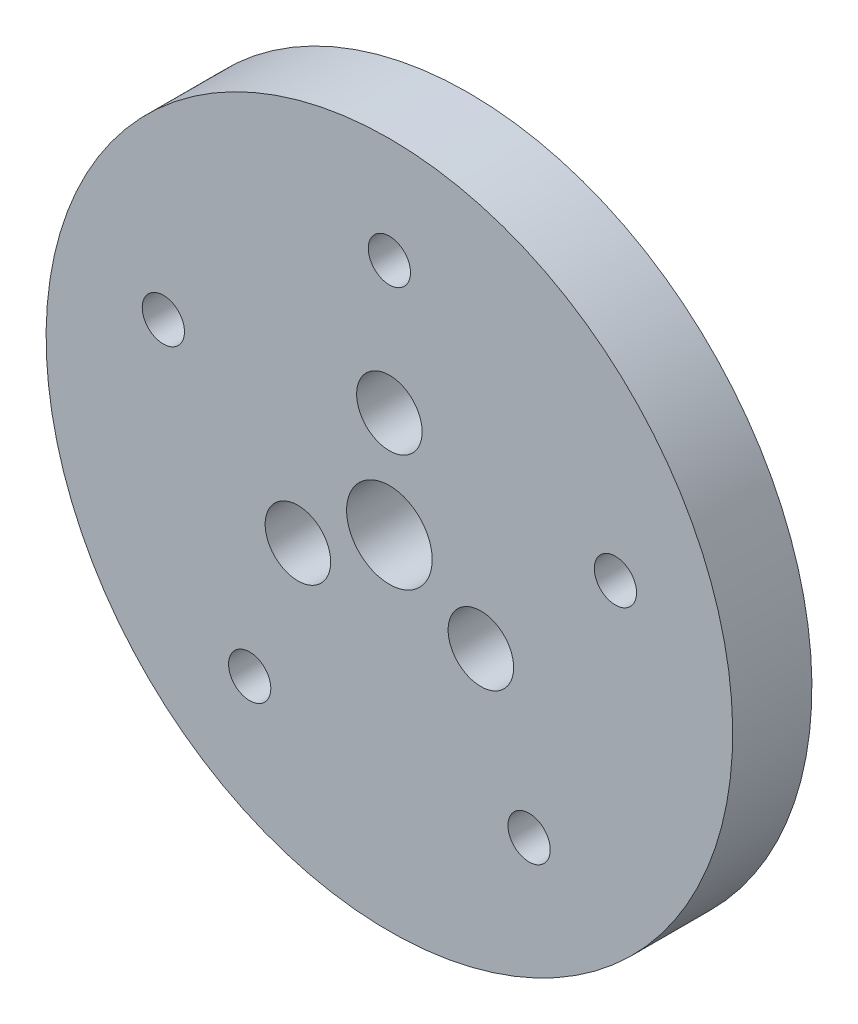
ISO-10303-21;
HEADER;
FILE_DESCRIPTION(('STEP AP214'),'2;1');
FILE_NAME('part.step','',(''),(''),'','','');
FILE_SCHEMA(('AUTOMOTIVE_DESIGN { 1 0 10303 214 1 1 1 1 }'));
ENDSEC;
DATA;
#1=APPLICATION_CONTEXT('core data for automotive mechanical design processes');
#2=APPLICATION_PROTOCOL_DEFINITION('international standard','automotive_design',2000,#1);
#3=PRODUCT_CONTEXT('',#1,'mechanical');
#4=PRODUCT('Part','Part','',(#3));
#5=PRODUCT_RELATED_PRODUCT_CATEGORY('part','',(#4));
#6=PRODUCT_DEFINITION_FORMATION('','',#4);
#7=PRODUCT_DEFINITION_CONTEXT('part definition',#1,'design');
#8=PRODUCT_DEFINITION('design','',#6,#7);
#9=PRODUCT_DEFINITION_SHAPE('','',#8);
#10=(LENGTH_UNIT() NAMED_UNIT(*) SI_UNIT(.MILLI.,.METRE.));
#11=(NAMED_UNIT(*) PLANE_ANGLE_UNIT() SI_UNIT($,.RADIAN.));
#12=(NAMED_UNIT(*) SI_UNIT($,.STERADIAN.) SOLID_ANGLE_UNIT());
#13=UNCERTAINTY_MEASURE_WITH_UNIT(LENGTH_MEASURE(1.E-05),#10,'distance_accuracy_value','');
#14=(GEOMETRIC_REPRESENTATION_CONTEXT(3) GLOBAL_UNCERTAINTY_ASSIGNED_CONTEXT((#13)) GLOBAL_UNIT_ASSIGNED_CONTEXT((#10,
#11,#12)) REPRESENTATION_CONTEXT('',''));
#15=CARTESIAN_POINT('',(0.,0.,0.));
#16=DIRECTION('',(0.,0.,1.));
#17=DIRECTION('',(1.,0.,0.));
#18=AXIS2_PLACEMENT_3D('',#15,#16,#17);
#19=CARTESIAN_POINT('',(0.,32.5,0.));
#20=DIRECTION('',(0.,0.,1.));
#21=DIRECTION('',(0.,-1.,0.));
#22=AXIS2_PLACEMENT_3D('',#19,#20,#21);
#23=PLANE('',#22);
#24=CARTESIAN_POINT('',(0.,10.,0.));
#25=DIRECTION('',(0.,0.,1.));
#26=DIRECTION('',(1.,0.,0.));
#27=AXIS2_PLACEMENT_3D('',#24,#25,#26);
#28=CIRCLE('',#27,3.1);
#29=CARTESIAN_POINT('',(3.1,10.,0.));
#30=VERTEX_POINT('',#29);
#31=EDGE_CURVE('E146',#30,#30,#28,.T.);
#32=ORIENTED_EDGE('',*,*,#31,.F.);
#33=EDGE_LOOP('',(#32));
#34=FACE_BOUND('',#33,.T.);
#35=CARTESIAN_POINT('',(8.66025403784437,-5.00000000000004,0.));
#36=DIRECTION('',(0.,0.,1.));
#37=DIRECTION('',(1.,0.,0.));
#38=AXIS2_PLACEMENT_3D('',#35,#36,#37);
#39=CIRCLE('',#38,3.1);
#40=CARTESIAN_POINT('',(11.7602540378444,-5.00000000000004,0.));
#41=VERTEX_POINT('',#40);
#42=EDGE_CURVE('E153',#41,#41,#39,.T.);
#43=ORIENTED_EDGE('',*,*,#42,.F.);
#44=EDGE_LOOP('',(#43));
#45=FACE_BOUND('',#44,.T.);
#46=CARTESIAN_POINT('',(-8.66025403784444,-4.99999999999992,0.));
#47=DIRECTION('',(0.,0.,1.));
#48=DIRECTION('',(1.,0.,0.));
#49=AXIS2_PLACEMENT_3D('',#46,#47,#48);
#50=CIRCLE('',#49,3.1);
#51=CARTESIAN_POINT('',(-5.56025403784444,-4.99999999999992,0.));
#52=VERTEX_POINT('',#51);
#53=EDGE_CURVE('E151',#52,#52,#50,.T.);
#54=ORIENTED_EDGE('',*,*,#53,.F.);
#55=EDGE_LOOP('',(#54));
#56=FACE_BOUND('',#55,.T.);
#57=CARTESIAN_POINT('',(-21.3987716166409,6.95288237343656,0.));
#58=DIRECTION('',(0.,0.,1.));
#59=DIRECTION('',(0.,-1.,0.));
#60=AXIS2_PLACEMENT_3D('',#57,#58,#59);
#61=CIRCLE('',#60,2.);
#62=CARTESIAN_POINT('',(-21.3987716166409,4.95288237343656,0.));
#63=VERTEX_POINT('',#62);
#64=EDGE_CURVE('E73',#63,#63,#61,.T.);
#65=ORIENTED_EDGE('',*,*,#64,.F.);
#66=EDGE_LOOP('',(#65));
#67=FACE_BOUND('',#66,.T.);
#68=CARTESIAN_POINT('',(-13.2251681765808,-18.2028823734362,0.));
#69=DIRECTION('',(0.,0.,1.));
#70=DIRECTION('',(0.,-1.,0.));
#71=AXIS2_PLACEMENT_3D('',#68,#69,#70);
#72=CIRCLE('',#71,2.);
#73=CARTESIAN_POINT('',(-13.2251681765808,-20.2028823734362,0.));
#74=VERTEX_POINT('',#73);
#75=EDGE_CURVE('E62',#74,#74,#72,.T.);
#76=ORIENTED_EDGE('',*,*,#75,.F.);
#77=EDGE_LOOP('',(#76));
#78=FACE_BOUND('',#77,.T.);
#79=CARTESIAN_POINT('',(13.2251681765805,-18.2028823734364,0.));
#80=DIRECTION('',(0.,0.,1.));
#81=DIRECTION('',(0.,-1.,0.));
#82=AXIS2_PLACEMENT_3D('',#79,#80,#81);
#83=CIRCLE('',#82,2.);
#84=CARTESIAN_POINT('',(13.2251681765805,-20.2028823734364,0.));
#85=VERTEX_POINT('',#84);
#86=EDGE_CURVE('E61',#85,#85,#83,.T.);
#87=ORIENTED_EDGE('',*,*,#86,.F.);
#88=EDGE_LOOP('',(#87));
#89=FACE_BOUND('',#88,.T.);
#90=CARTESIAN_POINT('',(21.398771616641,6.95288237343626,0.));
#91=DIRECTION('',(0.,0.,1.));
#92=DIRECTION('',(0.,-1.,0.));
#93=AXIS2_PLACEMENT_3D('',#90,#91,#92);
#94=CIRCLE('',#93,2.);
#95=CARTESIAN_POINT('',(21.398771616641,4.95288237343626,0.));
#96=VERTEX_POINT('',#95);
#97=EDGE_CURVE('E56',#96,#96,#94,.T.);
#98=ORIENTED_EDGE('',*,*,#97,.F.);
#99=EDGE_LOOP('',(#98));
#100=FACE_BOUND('',#99,.T.);
#101=CARTESIAN_POINT('',(0.,0.,0.));
#102=DIRECTION('',(0.,0.,1.));
#103=DIRECTION('',(1.,0.,0.));
#104=AXIS2_PLACEMENT_3D('',#101,#102,#103);
#105=CIRCLE('',#104,4.05);
#106=CARTESIAN_POINT('',(4.05,0.,0.));
#107=VERTEX_POINT('',#106);
#108=EDGE_CURVE('E90',#107,#107,#105,.T.);
#109=ORIENTED_EDGE('',*,*,#108,.F.);
#110=EDGE_LOOP('',(#109));
#111=FACE_BOUND('',#110,.T.);
#112=CARTESIAN_POINT('',(0.,22.5,0.));
#113=DIRECTION('',(0.,0.,1.));
#114=DIRECTION('',(1.,0.,0.));
#115=AXIS2_PLACEMENT_3D('',#112,#113,#114);
#116=CIRCLE('',#115,2.);
#117=CARTESIAN_POINT('',(2.,22.5,0.));
#118=VERTEX_POINT('',#117);
#119=EDGE_CURVE('E102',#118,#118,#116,.T.);
#120=ORIENTED_EDGE('',*,*,#119,.F.);
#121=EDGE_LOOP('',(#120));
#122=FACE_BOUND('',#121,.T.);
#123=CARTESIAN_POINT('',(0.,0.,0.));
#124=DIRECTION('',(0.,0.,-1.));
#125=DIRECTION('',(0.,1.,0.));
#126=AXIS2_PLACEMENT_3D('',#123,#124,#125);
#127=CIRCLE('',#126,32.5);
#128=CARTESIAN_POINT('',(0.,32.5,0.));
#129=VERTEX_POINT('',#128);
#130=EDGE_CURVE('E111',#129,#129,#127,.T.);
#131=ORIENTED_EDGE('',*,*,#130,.F.);
#132=EDGE_LOOP('',(#131));
#133=FACE_BOUND('',#132,.T.);
#134=ADVANCED_FACE('F39',(#34,#45,#56,#67,#78,#89,#100,#111,#122,#133),#23,.T.);
#135=CARTESIAN_POINT('',(0.,0.,-19.5));
#136=DIRECTION('',(0.,0.,-1.));
#137=DIRECTION('',(0.,1.,0.));
#138=AXIS2_PLACEMENT_3D('',#135,#136,#137);
#139=PLANE('',#138);
#140=CARTESIAN_POINT('',(0.,10.,-19.5));
#141=DIRECTION('',(0.,0.,-1.));
#142=DIRECTION('',(-1.,0.,0.));
#143=AXIS2_PLACEMENT_3D('',#140,#141,#142);
#144=CIRCLE('',#143,1.55);
#145=CARTESIAN_POINT('',(-1.55,10.,-19.5));
#146=VERTEX_POINT('',#145);
#147=EDGE_CURVE('E88',#146,#146,#144,.T.);
#148=ORIENTED_EDGE('',*,*,#147,.F.);
#149=EDGE_LOOP('',(#148));
#150=FACE_BOUND('',#149,.T.);
#151=CARTESIAN_POINT('',(-8.66025403784437,-5.00000000000004,-19.5));
#152=DIRECTION('',(0.,0.,-1.));
#153=DIRECTION('',(-1.,0.,0.));
#154=AXIS2_PLACEMENT_3D('',#151,#152,#153);
#155=CIRCLE('',#154,1.55);
#156=CARTESIAN_POINT('',(-10.2102540378444,-5.00000000000004,-19.5));
#157=VERTEX_POINT('',#156);
#158=EDGE_CURVE('E86',#157,#157,#155,.T.);
#159=ORIENTED_EDGE('',*,*,#158,.F.);
#160=EDGE_LOOP('',(#159));
#161=FACE_BOUND('',#160,.T.);
#162=CARTESIAN_POINT('',(8.66025403784443,-4.99999999999992,-19.5));
#163=DIRECTION('',(0.,0.,-1.));
#164=DIRECTION('',(-1.,0.,0.));
#165=AXIS2_PLACEMENT_3D('',#162,#163,#164);
#166=CIRCLE('',#165,1.55);
#167=CARTESIAN_POINT('',(7.11025403784443,-4.99999999999992,-19.5));
#168=VERTEX_POINT('',#167);
#169=EDGE_CURVE('E59',#168,#168,#166,.T.);
#170=ORIENTED_EDGE('',*,*,#169,.F.);
#171=EDGE_LOOP('',(#170));
#172=FACE_BOUND('',#171,.T.);
#173=CARTESIAN_POINT('',(0.,0.,-19.5));
#174=DIRECTION('',(0.,0.,1.));
#175=DIRECTION('',(1.,0.,0.));
#176=AXIS2_PLACEMENT_3D('',#173,#174,#175);
#177=CIRCLE('',#176,4.04999999999999);
#178=CARTESIAN_POINT('',(4.04999999999999,0.,-19.5));
#179=VERTEX_POINT('',#178);
#180=EDGE_CURVE('E105',#179,#179,#177,.T.);
#181=ORIENTED_EDGE('',*,*,#180,.T.);
#182=EDGE_LOOP('',(#181));
#183=FACE_BOUND('',#182,.T.);
#184=CARTESIAN_POINT('',(0.,0.,-19.5));
#185=DIRECTION('',(0.,0.,-1.));
#186=DIRECTION('',(0.,1.,0.));
#187=AXIS2_PLACEMENT_3D('',#184,#185,#186);
#188=CIRCLE('',#187,15.);
#189=CARTESIAN_POINT('',(0.,15.,-19.5));
#190=VERTEX_POINT('',#189);
#191=EDGE_CURVE('E10',#190,#190,#188,.T.);
#192=ORIENTED_EDGE('',*,*,#191,.T.);
#193=EDGE_LOOP('',(#192));
#194=FACE_BOUND('',#193,.T.);
#195=ADVANCED_FACE('F137',(#150,#161,#172,#183,#194),#139,.T.);
#196=CARTESIAN_POINT('',(0.,0.,0.));
#197=DIRECTION('',(0.,0.,-1.));
#198=DIRECTION('',(0.,1.,0.));
#199=AXIS2_PLACEMENT_3D('',#196,#197,#198);
#200=CYLINDRICAL_SURFACE('',#199,15.);
#201=CARTESIAN_POINT('',(0.,0.,-7.50000000000001));
#202=DIRECTION('',(0.,0.,-1.));
#203=DIRECTION('',(0.,1.,0.));
#204=AXIS2_PLACEMENT_3D('',#201,#202,#203);
#205=CIRCLE('',#204,15.);
#206=CARTESIAN_POINT('',(0.,15.,-7.5));
#207=VERTEX_POINT('',#206);
#208=EDGE_CURVE('E46',#207,#207,#205,.T.);
#209=ORIENTED_EDGE('',*,*,#208,.T.);
#210=EDGE_LOOP('',(#209));
#211=FACE_BOUND('',#210,.T.);
#212=ORIENTED_EDGE('',*,*,#191,.F.);
#213=EDGE_LOOP('',(#212));
#214=FACE_BOUND('',#213,.T.);
#215=ADVANCED_FACE('F134',(#211,#214),#200,.T.);
#216=CARTESIAN_POINT('',(0.,15.,-7.5));
#217=DIRECTION('',(0.,0.,-1.));
#218=DIRECTION('',(0.,1.,0.));
#219=AXIS2_PLACEMENT_3D('',#216,#217,#218);
#220=PLANE('',#219);
#221=CARTESIAN_POINT('',(-21.3987716166409,6.95288237343656,-7.50000000000001));
#222=DIRECTION('',(0.,0.,-1.));
#223=DIRECTION('',(0.,1.,0.));
#224=AXIS2_PLACEMENT_3D('',#221,#222,#223);
#225=CIRCLE('',#224,2.);
#226=CARTESIAN_POINT('',(-21.3987716166409,8.95288237343656,-7.50000000000001));
#227=VERTEX_POINT('',#226);
#228=EDGE_CURVE('E45',#227,#227,#225,.T.);
#229=ORIENTED_EDGE('',*,*,#228,.F.);
#230=EDGE_LOOP('',(#229));
#231=FACE_BOUND('',#230,.T.);
#232=CARTESIAN_POINT('',(-13.2251681765808,-18.2028823734362,-7.50000000000001));
#233=DIRECTION('',(0.,0.,-1.));
#234=DIRECTION('',(0.,1.,0.));
#235=AXIS2_PLACEMENT_3D('',#232,#233,#234);
#236=CIRCLE('',#235,2.);
#237=CARTESIAN_POINT('',(-13.2251681765808,-16.2028823734362,-7.50000000000001));
#238=VERTEX_POINT('',#237);
#239=EDGE_CURVE('E65',#238,#238,#236,.T.);
#240=ORIENTED_EDGE('',*,*,#239,.F.);
#241=EDGE_LOOP('',(#240));
#242=FACE_BOUND('',#241,.T.);
#243=CARTESIAN_POINT('',(13.2251681765805,-18.2028823734364,-7.50000000000001));
#244=DIRECTION('',(0.,0.,-1.));
#245=DIRECTION('',(0.,1.,0.));
#246=AXIS2_PLACEMENT_3D('',#243,#244,#245);
#247=CIRCLE('',#246,2.);
#248=CARTESIAN_POINT('',(13.2251681765805,-16.2028823734364,-7.50000000000001));
#249=VERTEX_POINT('',#248);
#250=EDGE_CURVE('E58',#249,#249,#247,.T.);
#251=ORIENTED_EDGE('',*,*,#250,.F.);
#252=EDGE_LOOP('',(#251));
#253=FACE_BOUND('',#252,.T.);
#254=CARTESIAN_POINT('',(21.398771616641,6.95288237343626,-7.50000000000001));
#255=DIRECTION('',(0.,0.,-1.));
#256=DIRECTION('',(0.,1.,0.));
#257=AXIS2_PLACEMENT_3D('',#254,#255,#256);
#258=CIRCLE('',#257,2.);
#259=CARTESIAN_POINT('',(21.398771616641,8.95288237343626,-7.50000000000001));
#260=VERTEX_POINT('',#259);
#261=EDGE_CURVE('E54',#260,#260,#258,.T.);
#262=ORIENTED_EDGE('',*,*,#261,.F.);
#263=EDGE_LOOP('',(#262));
#264=FACE_BOUND('',#263,.T.);
#265=CARTESIAN_POINT('',(0.,22.5,-7.5));
#266=DIRECTION('',(0.,0.,-1.));
#267=DIRECTION('',(0.,1.,0.));
#268=AXIS2_PLACEMENT_3D('',#265,#266,#267);
#269=CIRCLE('',#268,2.);
#270=CARTESIAN_POINT('',(0.,24.5,-7.5));
#271=VERTEX_POINT('',#270);
#272=EDGE_CURVE('E108',#271,#271,#269,.T.);
#273=ORIENTED_EDGE('',*,*,#272,.F.);
#274=EDGE_LOOP('',(#273));
#275=FACE_BOUND('',#274,.T.);
#276=CARTESIAN_POINT('',(0.,0.,-7.50000000000001));
#277=DIRECTION('',(0.,0.,-1.));
#278=DIRECTION('',(0.,1.,0.));
#279=AXIS2_PLACEMENT_3D('',#276,#277,#278);
#280=CIRCLE('',#279,32.5);
#281=CARTESIAN_POINT('',(0.,32.5,-7.5));
#282=VERTEX_POINT('',#281);
#283=EDGE_CURVE('E51',#282,#282,#280,.T.);
#284=ORIENTED_EDGE('',*,*,#283,.T.);
#285=EDGE_LOOP('',(#284));
#286=FACE_BOUND('',#285,.T.);
#287=ORIENTED_EDGE('',*,*,#208,.F.);
#288=EDGE_LOOP('',(#287));
#289=FACE_BOUND('',#288,.T.);
#290=ADVANCED_FACE('F116',(#231,#242,#253,#264,#275,#286,#289),#220,.T.);
#291=CARTESIAN_POINT('',(0.,0.,0.));
#292=DIRECTION('',(0.,0.,-1.));
#293=DIRECTION('',(0.,1.,0.));
#294=AXIS2_PLACEMENT_3D('',#291,#292,#293);
#295=CYLINDRICAL_SURFACE('',#294,32.5);
#296=ORIENTED_EDGE('',*,*,#130,.T.);
#297=EDGE_LOOP('',(#296));
#298=FACE_BOUND('',#297,.T.);
#299=ORIENTED_EDGE('',*,*,#283,.F.);
#300=EDGE_LOOP('',(#299));
#301=FACE_BOUND('',#300,.T.);
#302=ADVANCED_FACE('F118',(#298,#301),#295,.T.);
#303=CARTESIAN_POINT('',(0.,22.5,0.));
#304=DIRECTION('',(0.,0.,1.));
#305=DIRECTION('',(1.,0.,0.));
#306=AXIS2_PLACEMENT_3D('',#303,#304,#305);
#307=CYLINDRICAL_SURFACE('',#306,2.);
#308=ORIENTED_EDGE('',*,*,#272,.T.);
#309=EDGE_LOOP('',(#308));
#310=FACE_BOUND('',#309,.T.);
#311=ORIENTED_EDGE('',*,*,#119,.T.);
#312=EDGE_LOOP('',(#311));
#313=FACE_BOUND('',#312,.T.);
#314=ADVANCED_FACE('F122',(#310,#313),#307,.F.);
#315=CARTESIAN_POINT('',(0.,0.,0.));
#316=DIRECTION('',(0.,0.,1.));
#317=DIRECTION('',(1.,0.,0.));
#318=AXIS2_PLACEMENT_3D('',#315,#316,#317);
#319=CYLINDRICAL_SURFACE('',#318,4.05);
#320=ORIENTED_EDGE('',*,*,#180,.F.);
#321=EDGE_LOOP('',(#320));
#322=FACE_BOUND('',#321,.T.);
#323=ORIENTED_EDGE('',*,*,#108,.T.);
#324=EDGE_LOOP('',(#323));
#325=FACE_BOUND('',#324,.T.);
#326=ADVANCED_FACE('F130',(#322,#325),#319,.F.);
#327=CARTESIAN_POINT('',(8.66025403784443,-4.99999999999992,-7.5));
#328=DIRECTION('',(0.,0.,-1.));
#329=DIRECTION('',(-1.,0.,0.));
#330=AXIS2_PLACEMENT_3D('',#327,#328,#329);
#331=CYLINDRICAL_SURFACE('',#330,1.55);
#332=CARTESIAN_POINT('',(8.66025403784443,-4.99999999999992,-7.5));
#333=DIRECTION('',(0.,0.,-1.));
#334=DIRECTION('',(-1.,0.,0.));
#335=AXIS2_PLACEMENT_3D('',#332,#333,#334);
#336=CIRCLE('',#335,1.55);
#337=CARTESIAN_POINT('',(7.11025403784443,-4.99999999999992,-7.5));
#338=VERTEX_POINT('',#337);
#339=EDGE_CURVE('E93',#338,#338,#336,.T.);
#340=ORIENTED_EDGE('',*,*,#339,.F.);
#341=EDGE_LOOP('',(#340));
#342=FACE_BOUND('',#341,.T.);
#343=ORIENTED_EDGE('',*,*,#169,.T.);
#344=EDGE_LOOP('',(#343));
#345=FACE_BOUND('',#344,.T.);
#346=ADVANCED_FACE('F175',(#342,#345),#331,.F.);
#347=CARTESIAN_POINT('',(-8.66025403784437,-5.00000000000004,-7.5));
#348=DIRECTION('',(0.,0.,-1.));
#349=DIRECTION('',(-1.,0.,0.));
#350=AXIS2_PLACEMENT_3D('',#347,#348,#349);
#351=CYLINDRICAL_SURFACE('',#350,1.55);
#352=CARTESIAN_POINT('',(-8.66025403784437,-5.00000000000004,-7.5));
#353=DIRECTION('',(0.,0.,-1.));
#354=DIRECTION('',(-1.,0.,0.));
#355=AXIS2_PLACEMENT_3D('',#352,#353,#354);
#356=CIRCLE('',#355,1.55);
#357=CARTESIAN_POINT('',(-10.2102540378444,-5.00000000000004,-7.5));
#358=VERTEX_POINT('',#357);
#359=EDGE_CURVE('E83',#358,#358,#356,.T.);
#360=ORIENTED_EDGE('',*,*,#359,.F.);
#361=EDGE_LOOP('',(#360));
#362=FACE_BOUND('',#361,.T.);
#363=ORIENTED_EDGE('',*,*,#158,.T.);
#364=EDGE_LOOP('',(#363));
#365=FACE_BOUND('',#364,.T.);
#366=ADVANCED_FACE('F178',(#362,#365),#351,.F.);
#367=CARTESIAN_POINT('',(0.,10.,-7.5));
#368=DIRECTION('',(0.,0.,-1.));
#369=DIRECTION('',(-1.,0.,0.));
#370=AXIS2_PLACEMENT_3D('',#367,#368,#369);
#371=CYLINDRICAL_SURFACE('',#370,1.55);
#372=CARTESIAN_POINT('',(0.,10.,-7.5));
#373=DIRECTION('',(0.,0.,-1.));
#374=DIRECTION('',(-1.,0.,0.));
#375=AXIS2_PLACEMENT_3D('',#372,#373,#374);
#376=CIRCLE('',#375,1.55);
#377=CARTESIAN_POINT('',(-1.55,10.,-7.5));
#378=VERTEX_POINT('',#377);
#379=EDGE_CURVE('E84',#378,#378,#376,.T.);
#380=ORIENTED_EDGE('',*,*,#379,.F.);
#381=EDGE_LOOP('',(#380));
#382=FACE_BOUND('',#381,.T.);
#383=ORIENTED_EDGE('',*,*,#147,.T.);
#384=EDGE_LOOP('',(#383));
#385=FACE_BOUND('',#384,.T.);
#386=ADVANCED_FACE('F184',(#382,#385),#371,.F.);
#387=CARTESIAN_POINT('',(21.398771616641,6.95288237343626,0.));
#388=DIRECTION('',(0.,0.,1.));
#389=DIRECTION('',(0.,-1.,0.));
#390=AXIS2_PLACEMENT_3D('',#387,#388,#389);
#391=CYLINDRICAL_SURFACE('',#390,2.);
#392=ORIENTED_EDGE('',*,*,#261,.T.);
#393=EDGE_LOOP('',(#392));
#394=FACE_BOUND('',#393,.T.);
#395=ORIENTED_EDGE('',*,*,#97,.T.);
#396=EDGE_LOOP('',(#395));
#397=FACE_BOUND('',#396,.T.);
#398=ADVANCED_FACE('F186',(#394,#397),#391,.F.);
#399=CARTESIAN_POINT('',(13.2251681765805,-18.2028823734364,0.));
#400=DIRECTION('',(0.,0.,1.));
#401=DIRECTION('',(0.,-1.,0.));
#402=AXIS2_PLACEMENT_3D('',#399,#400,#401);
#403=CYLINDRICAL_SURFACE('',#402,2.);
#404=ORIENTED_EDGE('',*,*,#250,.T.);
#405=EDGE_LOOP('',(#404));
#406=FACE_BOUND('',#405,.T.);
#407=ORIENTED_EDGE('',*,*,#86,.T.);
#408=EDGE_LOOP('',(#407));
#409=FACE_BOUND('',#408,.T.);
#410=ADVANCED_FACE('F195',(#406,#409),#403,.F.);
#411=CARTESIAN_POINT('',(-13.2251681765808,-18.2028823734362,0.));
#412=DIRECTION('',(0.,0.,1.));
#413=DIRECTION('',(0.,-1.,0.));
#414=AXIS2_PLACEMENT_3D('',#411,#412,#413);
#415=CYLINDRICAL_SURFACE('',#414,2.);
#416=ORIENTED_EDGE('',*,*,#239,.T.);
#417=EDGE_LOOP('',(#416));
#418=FACE_BOUND('',#417,.T.);
#419=ORIENTED_EDGE('',*,*,#75,.T.);
#420=EDGE_LOOP('',(#419));
#421=FACE_BOUND('',#420,.T.);
#422=ADVANCED_FACE('F199',(#418,#421),#415,.F.);
#423=CARTESIAN_POINT('',(-21.3987716166409,6.95288237343656,0.));
#424=DIRECTION('',(0.,0.,1.));
#425=DIRECTION('',(0.,-1.,0.));
#426=AXIS2_PLACEMENT_3D('',#423,#424,#425);
#427=CYLINDRICAL_SURFACE('',#426,2.);
#428=ORIENTED_EDGE('',*,*,#228,.T.);
#429=EDGE_LOOP('',(#428));
#430=FACE_BOUND('',#429,.T.);
#431=ORIENTED_EDGE('',*,*,#64,.T.);
#432=EDGE_LOOP('',(#431));
#433=FACE_BOUND('',#432,.T.);
#434=ADVANCED_FACE('F202',(#430,#433),#427,.F.);
#435=CARTESIAN_POINT('',(-8.66025403784444,-4.99999999999992,-7.5));
#436=DIRECTION('',(0.,0.,1.));
#437=DIRECTION('',(1.,0.,0.));
#438=AXIS2_PLACEMENT_3D('',#435,#436,#437);
#439=PLANE('',#438);
#440=CARTESIAN_POINT('',(-8.66025403784444,-4.99999999999992,-7.5));
#441=DIRECTION('',(0.,0.,1.));
#442=DIRECTION('',(1.,0.,0.));
#443=AXIS2_PLACEMENT_3D('',#440,#441,#442);
#444=CIRCLE('',#443,3.1);
#445=CARTESIAN_POINT('',(-5.56025403784444,-4.99999999999992,-7.5));
#446=VERTEX_POINT('',#445);
#447=EDGE_CURVE('E247',#446,#446,#444,.T.);
#448=ORIENTED_EDGE('',*,*,#447,.T.);
#449=EDGE_LOOP('',(#448));
#450=FACE_BOUND('',#449,.T.);
#451=ORIENTED_EDGE('',*,*,#359,.T.);
#452=EDGE_LOOP('',(#451));
#453=FACE_BOUND('',#452,.T.);
#454=ADVANCED_FACE('F205',(#450,#453),#439,.T.);
#455=CARTESIAN_POINT('',(-8.66025403784444,-4.99999999999992,-7.5));
#456=DIRECTION('',(0.,0.,1.));
#457=DIRECTION('',(1.,0.,0.));
#458=AXIS2_PLACEMENT_3D('',#455,#456,#457);
#459=CYLINDRICAL_SURFACE('',#458,3.1);
#460=ORIENTED_EDGE('',*,*,#447,.F.);
#461=EDGE_LOOP('',(#460));
#462=FACE_BOUND('',#461,.T.);
#463=ORIENTED_EDGE('',*,*,#53,.T.);
#464=EDGE_LOOP('',(#463));
#465=FACE_BOUND('',#464,.T.);
#466=ADVANCED_FACE('F207',(#462,#465),#459,.F.);
#467=CARTESIAN_POINT('',(8.66025403784437,-5.00000000000004,-7.5));
#468=DIRECTION('',(0.,0.,1.));
#469=DIRECTION('',(1.,0.,0.));
#470=AXIS2_PLACEMENT_3D('',#467,#468,#469);
#471=PLANE('',#470);
#472=CARTESIAN_POINT('',(8.66025403784437,-5.00000000000004,-7.5));
#473=DIRECTION('',(0.,0.,1.));
#474=DIRECTION('',(1.,0.,0.));
#475=AXIS2_PLACEMENT_3D('',#472,#473,#474);
#476=CIRCLE('',#475,3.1);
#477=CARTESIAN_POINT('',(11.7602540378444,-5.00000000000004,-7.5));
#478=VERTEX_POINT('',#477);
#479=EDGE_CURVE('E244',#478,#478,#476,.T.);
#480=ORIENTED_EDGE('',*,*,#479,.T.);
#481=EDGE_LOOP('',(#480));
#482=FACE_BOUND('',#481,.T.);
#483=ORIENTED_EDGE('',*,*,#339,.T.);
#484=EDGE_LOOP('',(#483));
#485=FACE_BOUND('',#484,.T.);
#486=ADVANCED_FACE('F208',(#482,#485),#471,.T.);
#487=CARTESIAN_POINT('',(8.66025403784437,-5.00000000000004,-7.5));
#488=DIRECTION('',(0.,0.,1.));
#489=DIRECTION('',(1.,0.,0.));
#490=AXIS2_PLACEMENT_3D('',#487,#488,#489);
#491=CYLINDRICAL_SURFACE('',#490,3.1);
#492=ORIENTED_EDGE('',*,*,#479,.F.);
#493=EDGE_LOOP('',(#492));
#494=FACE_BOUND('',#493,.T.);
#495=ORIENTED_EDGE('',*,*,#42,.T.);
#496=EDGE_LOOP('',(#495));
#497=FACE_BOUND('',#496,.T.);
#498=ADVANCED_FACE('F213',(#494,#497),#491,.F.);
#499=CARTESIAN_POINT('',(0.,10.,-7.5));
#500=DIRECTION('',(0.,0.,1.));
#501=DIRECTION('',(1.,0.,0.));
#502=AXIS2_PLACEMENT_3D('',#499,#500,#501);
#503=PLANE('',#502);
#504=CARTESIAN_POINT('',(0.,10.,-7.5));
#505=DIRECTION('',(0.,0.,1.));
#506=DIRECTION('',(1.,0.,0.));
#507=AXIS2_PLACEMENT_3D('',#504,#505,#506);
#508=CIRCLE('',#507,3.1);
#509=CARTESIAN_POINT('',(3.1,10.,-7.5));
#510=VERTEX_POINT('',#509);
#511=EDGE_CURVE('E82',#510,#510,#508,.T.);
#512=ORIENTED_EDGE('',*,*,#511,.T.);
#513=EDGE_LOOP('',(#512));
#514=FACE_BOUND('',#513,.T.);
#515=ORIENTED_EDGE('',*,*,#379,.T.);
#516=EDGE_LOOP('',(#515));
#517=FACE_BOUND('',#516,.T.);
#518=ADVANCED_FACE('F217',(#514,#517),#503,.T.);
#519=CARTESIAN_POINT('',(0.,10.,-7.5));
#520=DIRECTION('',(0.,0.,1.));
#521=DIRECTION('',(1.,0.,0.));
#522=AXIS2_PLACEMENT_3D('',#519,#520,#521);
#523=CYLINDRICAL_SURFACE('',#522,3.1);
#524=ORIENTED_EDGE('',*,*,#511,.F.);
#525=EDGE_LOOP('',(#524));
#526=FACE_BOUND('',#525,.T.);
#527=ORIENTED_EDGE('',*,*,#31,.T.);
#528=EDGE_LOOP('',(#527));
#529=FACE_BOUND('',#528,.T.);
#530=ADVANCED_FACE('F216',(#526,#529),#523,.F.);
#531=CLOSED_SHELL('',(#134,#195,#215,#290,#302,#314,#326,#346,#366,#386,#398,#410,#422,#434,
#454,#466,#486,#498,#518,#530));
#532=MANIFOLD_SOLID_BREP('B2',#531);
#533=ADVANCED_BREP_SHAPE_REPRESENTATION('',(#18,#532),#14);
#534=SHAPE_DEFINITION_REPRESENTATION(#9,#533);
ENDSEC;
END-ISO-10303-21;
